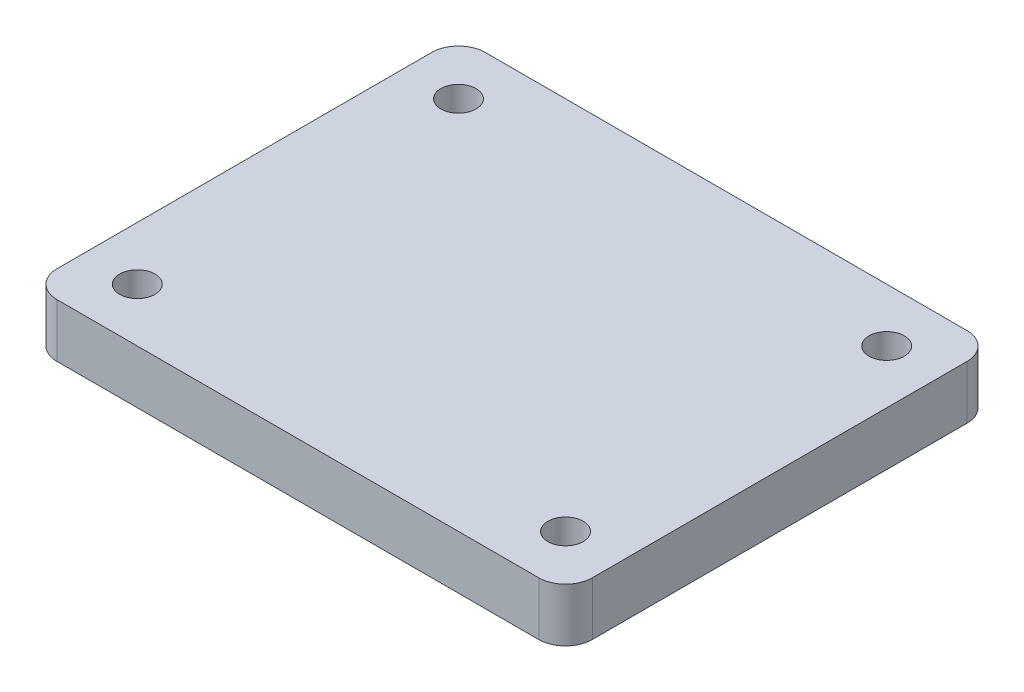
ISO-10303-21;
HEADER;
FILE_DESCRIPTION(('STEP AP214'),'2;1');
FILE_NAME('part.step','',(''),(''),'','','');
FILE_SCHEMA(('AUTOMOTIVE_DESIGN { 1 0 10303 214 1 1 1 1 }'));
ENDSEC;
DATA;
#1=APPLICATION_CONTEXT('core data for automotive mechanical design processes');
#2=APPLICATION_PROTOCOL_DEFINITION('international standard','automotive_design',2000,#1);
#3=PRODUCT_CONTEXT('',#1,'mechanical');
#4=PRODUCT('Part','Part','',(#3));
#5=PRODUCT_RELATED_PRODUCT_CATEGORY('part','',(#4));
#6=PRODUCT_DEFINITION_FORMATION('','',#4);
#7=PRODUCT_DEFINITION_CONTEXT('part definition',#1,'design');
#8=PRODUCT_DEFINITION('design','',#6,#7);
#9=PRODUCT_DEFINITION_SHAPE('','',#8);
#10=(LENGTH_UNIT() NAMED_UNIT(*) SI_UNIT(.MILLI.,.METRE.));
#11=(NAMED_UNIT(*) PLANE_ANGLE_UNIT() SI_UNIT($,.RADIAN.));
#12=(NAMED_UNIT(*) SI_UNIT($,.STERADIAN.) SOLID_ANGLE_UNIT());
#13=UNCERTAINTY_MEASURE_WITH_UNIT(LENGTH_MEASURE(1.E-05),#10,'distance_accuracy_value','');
#14=(GEOMETRIC_REPRESENTATION_CONTEXT(3) GLOBAL_UNCERTAINTY_ASSIGNED_CONTEXT((#13)) GLOBAL_UNIT_ASSIGNED_CONTEXT((#10,
#11,#12)) REPRESENTATION_CONTEXT('',''));
#15=CARTESIAN_POINT('',(0.,0.,0.));
#16=DIRECTION('',(0.,0.,1.));
#17=DIRECTION('',(1.,0.,0.));
#18=AXIS2_PLACEMENT_3D('',#15,#16,#17);
#19=CARTESIAN_POINT('',(0.,10.,0.));
#20=DIRECTION('',(1.,0.,0.));
#21=DIRECTION('',(0.,0.,-1.));
#22=AXIS2_PLACEMENT_3D('',#19,#20,#21);
#23=PLANE('',#22);
#24=DIRECTION('',(0.,0.,1.));
#25=VECTOR('',#24,1.);
#26=CARTESIAN_POINT('',(0.,10.,0.));
#27=LINE('',#26,#25);
#28=CARTESIAN_POINT('',(0.,10.,-75.));
#29=VERTEX_POINT('',#28);
#30=CARTESIAN_POINT('',(0.,10.,-5.));
#31=VERTEX_POINT('',#30);
#32=EDGE_CURVE('E122',#29,#31,#27,.T.);
#33=ORIENTED_EDGE('',*,*,#32,.F.);
#34=DIRECTION('',(0.,-1.,0.));
#35=VECTOR('',#34,1.);
#36=CARTESIAN_POINT('',(0.,10.,-75.));
#37=LINE('',#36,#35);
#38=CARTESIAN_POINT('',(0.,0.,-75.));
#39=VERTEX_POINT('',#38);
#40=EDGE_CURVE('E107',#29,#39,#37,.T.);
#41=ORIENTED_EDGE('',*,*,#40,.T.);
#42=DIRECTION('',(0.,0.,1.));
#43=VECTOR('',#42,1.);
#44=CARTESIAN_POINT('',(0.,0.,0.));
#45=LINE('',#44,#43);
#46=CARTESIAN_POINT('',(0.,0.,-5.));
#47=VERTEX_POINT('',#46);
#48=EDGE_CURVE('E119',#39,#47,#45,.T.);
#49=ORIENTED_EDGE('',*,*,#48,.T.);
#50=DIRECTION('',(0.,-1.,0.));
#51=VECTOR('',#50,1.);
#52=CARTESIAN_POINT('',(0.,10.,-5.));
#53=LINE('',#52,#51);
#54=EDGE_CURVE('E124',#47,#31,#53,.F.);
#55=ORIENTED_EDGE('',*,*,#54,.T.);
#56=EDGE_LOOP('',(#33,#41,#49,#55));
#57=FACE_BOUND('',#56,.T.);
#58=ADVANCED_FACE('F37',(#57),#23,.F.);
#59=CARTESIAN_POINT('',(0.,10.,0.));
#60=DIRECTION('',(0.,0.,-1.));
#61=DIRECTION('',(-1.,0.,0.));
#62=AXIS2_PLACEMENT_3D('',#59,#60,#61);
#63=PLANE('',#62);
#64=DIRECTION('',(1.,0.,0.));
#65=VECTOR('',#64,1.);
#66=CARTESIAN_POINT('',(0.,0.,0.));
#67=LINE('',#66,#65);
#68=CARTESIAN_POINT('',(5.,0.,0.));
#69=VERTEX_POINT('',#68);
#70=CARTESIAN_POINT('',(95.,0.,0.));
#71=VERTEX_POINT('',#70);
#72=EDGE_CURVE('E128',#69,#71,#67,.T.);
#73=ORIENTED_EDGE('',*,*,#72,.T.);
#74=DIRECTION('',(0.,-1.,0.));
#75=VECTOR('',#74,1.);
#76=CARTESIAN_POINT('',(95.,10.,0.));
#77=LINE('',#76,#75);
#78=CARTESIAN_POINT('',(95.,10.,0.));
#79=VERTEX_POINT('',#78);
#80=EDGE_CURVE('E11',#71,#79,#77,.F.);
#81=ORIENTED_EDGE('',*,*,#80,.T.);
#82=DIRECTION('',(1.,0.,0.));
#83=VECTOR('',#82,1.);
#84=CARTESIAN_POINT('',(0.,10.,0.));
#85=LINE('',#84,#83);
#86=CARTESIAN_POINT('',(5.,10.,0.));
#87=VERTEX_POINT('',#86);
#88=EDGE_CURVE('E168',#87,#79,#85,.T.);
#89=ORIENTED_EDGE('',*,*,#88,.F.);
#90=DIRECTION('',(0.,-1.,0.));
#91=VECTOR('',#90,1.);
#92=CARTESIAN_POINT('',(5.,10.,0.));
#93=LINE('',#92,#91);
#94=EDGE_CURVE('E45',#87,#69,#93,.T.);
#95=ORIENTED_EDGE('',*,*,#94,.T.);
#96=EDGE_LOOP('',(#73,#81,#89,#95));
#97=FACE_BOUND('',#96,.T.);
#98=ADVANCED_FACE('F166',(#97),#63,.F.);
#99=CARTESIAN_POINT('',(100.,10.,0.));
#100=DIRECTION('',(-1.,0.,0.));
#101=DIRECTION('',(0.,0.,1.));
#102=AXIS2_PLACEMENT_3D('',#99,#100,#101);
#103=PLANE('',#102);
#104=DIRECTION('',(0.,0.,-1.));
#105=VECTOR('',#104,1.);
#106=CARTESIAN_POINT('',(100.,0.,0.));
#107=LINE('',#106,#105);
#108=CARTESIAN_POINT('',(100.,0.,-5.));
#109=VERTEX_POINT('',#108);
#110=CARTESIAN_POINT('',(100.,0.,-75.));
#111=VERTEX_POINT('',#110);
#112=EDGE_CURVE('E132',#109,#111,#107,.T.);
#113=ORIENTED_EDGE('',*,*,#112,.T.);
#114=DIRECTION('',(0.,-1.,0.));
#115=VECTOR('',#114,1.);
#116=CARTESIAN_POINT('',(100.,10.,-75.));
#117=LINE('',#116,#115);
#118=CARTESIAN_POINT('',(100.,10.,-75.));
#119=VERTEX_POINT('',#118);
#120=EDGE_CURVE('E52',#111,#119,#117,.F.);
#121=ORIENTED_EDGE('',*,*,#120,.T.);
#122=DIRECTION('',(0.,0.,-1.));
#123=VECTOR('',#122,1.);
#124=CARTESIAN_POINT('',(100.,10.,0.));
#125=LINE('',#124,#123);
#126=CARTESIAN_POINT('',(100.,10.,-5.));
#127=VERTEX_POINT('',#126);
#128=EDGE_CURVE('E176',#127,#119,#125,.T.);
#129=ORIENTED_EDGE('',*,*,#128,.F.);
#130=DIRECTION('',(0.,-1.,0.));
#131=VECTOR('',#130,1.);
#132=CARTESIAN_POINT('',(100.,10.,-5.));
#133=LINE('',#132,#131);
#134=EDGE_CURVE('E159',#127,#109,#133,.T.);
#135=ORIENTED_EDGE('',*,*,#134,.T.);
#136=EDGE_LOOP('',(#113,#121,#129,#135));
#137=FACE_BOUND('',#136,.T.);
#138=ADVANCED_FACE('F175',(#137),#103,.F.);
#139=CARTESIAN_POINT('',(0.,10.,-80.));
#140=DIRECTION('',(0.,0.,1.));
#141=DIRECTION('',(1.,0.,0.));
#142=AXIS2_PLACEMENT_3D('',#139,#140,#141);
#143=PLANE('',#142);
#144=DIRECTION('',(-1.,0.,0.));
#145=VECTOR('',#144,1.);
#146=CARTESIAN_POINT('',(0.,0.,-80.));
#147=LINE('',#146,#145);
#148=CARTESIAN_POINT('',(95.,0.,-80.));
#149=VERTEX_POINT('',#148);
#150=CARTESIAN_POINT('',(5.,0.,-80.));
#151=VERTEX_POINT('',#150);
#152=EDGE_CURVE('E142',#149,#151,#147,.T.);
#153=ORIENTED_EDGE('',*,*,#152,.T.);
#154=DIRECTION('',(0.,-1.,0.));
#155=VECTOR('',#154,1.);
#156=CARTESIAN_POINT('',(5.,10.,-80.));
#157=LINE('',#156,#155);
#158=CARTESIAN_POINT('',(5.,10.,-80.));
#159=VERTEX_POINT('',#158);
#160=EDGE_CURVE('E108',#151,#159,#157,.F.);
#161=ORIENTED_EDGE('',*,*,#160,.T.);
#162=DIRECTION('',(-1.,0.,0.));
#163=VECTOR('',#162,1.);
#164=CARTESIAN_POINT('',(0.,10.,-80.));
#165=LINE('',#164,#163);
#166=CARTESIAN_POINT('',(95.,10.,-80.));
#167=VERTEX_POINT('',#166);
#168=EDGE_CURVE('E138',#167,#159,#165,.T.);
#169=ORIENTED_EDGE('',*,*,#168,.F.);
#170=DIRECTION('',(0.,-1.,0.));
#171=VECTOR('',#170,1.);
#172=CARTESIAN_POINT('',(95.,10.,-80.));
#173=LINE('',#172,#171);
#174=EDGE_CURVE('E113',#167,#149,#173,.T.);
#175=ORIENTED_EDGE('',*,*,#174,.T.);
#176=EDGE_LOOP('',(#153,#161,#169,#175));
#177=FACE_BOUND('',#176,.T.);
#178=ADVANCED_FACE('F209',(#177),#143,.F.);
#179=CARTESIAN_POINT('',(0.,10.,0.));
#180=DIRECTION('',(0.,-1.,0.));
#181=DIRECTION('',(0.,0.,-1.));
#182=AXIS2_PLACEMENT_3D('',#179,#180,#181);
#183=PLANE('',#182);
#184=CARTESIAN_POINT('',(90.,10.,-10.));
#185=DIRECTION('',(0.,1.,0.));
#186=DIRECTION('',(0.,0.,1.));
#187=AXIS2_PLACEMENT_3D('',#184,#185,#186);
#188=CIRCLE('',#187,3.3);
#189=CARTESIAN_POINT('',(90.,10.,-6.7));
#190=VERTEX_POINT('',#189);
#191=EDGE_CURVE('E183',#190,#190,#188,.T.);
#192=ORIENTED_EDGE('',*,*,#191,.F.);
#193=EDGE_LOOP('',(#192));
#194=FACE_BOUND('',#193,.T.);
#195=CARTESIAN_POINT('',(10.,10.,-70.));
#196=DIRECTION('',(0.,1.,0.));
#197=DIRECTION('',(0.,0.,1.));
#198=AXIS2_PLACEMENT_3D('',#195,#196,#197);
#199=CIRCLE('',#198,3.3);
#200=CARTESIAN_POINT('',(10.,10.,-66.7));
#201=VERTEX_POINT('',#200);
#202=EDGE_CURVE('E188',#201,#201,#199,.T.);
#203=ORIENTED_EDGE('',*,*,#202,.F.);
#204=EDGE_LOOP('',(#203));
#205=FACE_BOUND('',#204,.T.);
#206=CARTESIAN_POINT('',(90.,10.,-70.));
#207=DIRECTION('',(0.,1.,0.));
#208=DIRECTION('',(0.,0.,1.));
#209=AXIS2_PLACEMENT_3D('',#206,#207,#208);
#210=CIRCLE('',#209,3.3);
#211=CARTESIAN_POINT('',(90.,10.,-66.7));
#212=VERTEX_POINT('',#211);
#213=EDGE_CURVE('E189',#212,#212,#210,.T.);
#214=ORIENTED_EDGE('',*,*,#213,.F.);
#215=EDGE_LOOP('',(#214));
#216=FACE_BOUND('',#215,.T.);
#217=CARTESIAN_POINT('',(10.,10.,-10.));
#218=DIRECTION('',(0.,1.,0.));
#219=DIRECTION('',(0.,0.,1.));
#220=AXIS2_PLACEMENT_3D('',#217,#218,#219);
#221=CIRCLE('',#220,3.3);
#222=CARTESIAN_POINT('',(10.,10.,-6.7));
#223=VERTEX_POINT('',#222);
#224=EDGE_CURVE('E129',#223,#223,#221,.T.);
#225=ORIENTED_EDGE('',*,*,#224,.F.);
#226=EDGE_LOOP('',(#225));
#227=FACE_BOUND('',#226,.T.);
#228=ORIENTED_EDGE('',*,*,#168,.T.);
#229=CARTESIAN_POINT('',(5.,10.,-75.));
#230=DIRECTION('',(0.,-1.,0.));
#231=DIRECTION('',(0.,0.,-1.));
#232=AXIS2_PLACEMENT_3D('',#229,#230,#231);
#233=CIRCLE('',#232,5.);
#234=EDGE_CURVE('E157',#159,#29,#233,.F.);
#235=ORIENTED_EDGE('',*,*,#234,.T.);
#236=ORIENTED_EDGE('',*,*,#32,.T.);
#237=CARTESIAN_POINT('',(5.,10.,-5.));
#238=DIRECTION('',(0.,-1.,0.));
#239=DIRECTION('',(0.,0.,-1.));
#240=AXIS2_PLACEMENT_3D('',#237,#238,#239);
#241=CIRCLE('',#240,5.);
#242=EDGE_CURVE('E152',#31,#87,#241,.F.);
#243=ORIENTED_EDGE('',*,*,#242,.T.);
#244=ORIENTED_EDGE('',*,*,#88,.T.);
#245=CARTESIAN_POINT('',(95.,10.,-5.));
#246=DIRECTION('',(0.,-1.,0.));
#247=DIRECTION('',(0.,0.,-1.));
#248=AXIS2_PLACEMENT_3D('',#245,#246,#247);
#249=CIRCLE('',#248,5.);
#250=EDGE_CURVE('E59',#79,#127,#249,.F.);
#251=ORIENTED_EDGE('',*,*,#250,.T.);
#252=ORIENTED_EDGE('',*,*,#128,.T.);
#253=CARTESIAN_POINT('',(95.,10.,-75.));
#254=DIRECTION('',(0.,-1.,0.));
#255=DIRECTION('',(0.,0.,-1.));
#256=AXIS2_PLACEMENT_3D('',#253,#254,#255);
#257=CIRCLE('',#256,5.);
#258=EDGE_CURVE('E155',#119,#167,#257,.F.);
#259=ORIENTED_EDGE('',*,*,#258,.T.);
#260=EDGE_LOOP('',(#228,#235,#236,#243,#244,#251,#252,#259));
#261=FACE_BOUND('',#260,.T.);
#262=ADVANCED_FACE('F206',(#194,#205,#216,#227,#261),#183,.F.);
#263=CARTESIAN_POINT('',(0.,0.,0.));
#264=DIRECTION('',(0.,-1.,0.));
#265=DIRECTION('',(0.,0.,-1.));
#266=AXIS2_PLACEMENT_3D('',#263,#264,#265);
#267=PLANE('',#266);
#268=CARTESIAN_POINT('',(90.,0.,-10.));
#269=DIRECTION('',(0.,1.,0.));
#270=DIRECTION('',(0.,0.,1.));
#271=AXIS2_PLACEMENT_3D('',#268,#269,#270);
#272=CIRCLE('',#271,3.3);
#273=CARTESIAN_POINT('',(90.,0.,-6.7));
#274=VERTEX_POINT('',#273);
#275=EDGE_CURVE('E192',#274,#274,#272,.T.);
#276=ORIENTED_EDGE('',*,*,#275,.T.);
#277=EDGE_LOOP('',(#276));
#278=FACE_BOUND('',#277,.T.);
#279=CARTESIAN_POINT('',(10.,0.,-70.));
#280=DIRECTION('',(0.,1.,0.));
#281=DIRECTION('',(0.,0.,1.));
#282=AXIS2_PLACEMENT_3D('',#279,#280,#281);
#283=CIRCLE('',#282,3.3);
#284=CARTESIAN_POINT('',(10.,0.,-66.7));
#285=VERTEX_POINT('',#284);
#286=EDGE_CURVE('E185',#285,#285,#283,.T.);
#287=ORIENTED_EDGE('',*,*,#286,.T.);
#288=EDGE_LOOP('',(#287));
#289=FACE_BOUND('',#288,.T.);
#290=CARTESIAN_POINT('',(90.,0.,-70.));
#291=DIRECTION('',(0.,1.,0.));
#292=DIRECTION('',(0.,0.,1.));
#293=AXIS2_PLACEMENT_3D('',#290,#291,#292);
#294=CIRCLE('',#293,3.3);
#295=CARTESIAN_POINT('',(90.,0.,-66.7));
#296=VERTEX_POINT('',#295);
#297=EDGE_CURVE('E197',#296,#296,#294,.T.);
#298=ORIENTED_EDGE('',*,*,#297,.T.);
#299=EDGE_LOOP('',(#298));
#300=FACE_BOUND('',#299,.T.);
#301=CARTESIAN_POINT('',(10.,0.,-10.));
#302=DIRECTION('',(0.,1.,0.));
#303=DIRECTION('',(0.,0.,1.));
#304=AXIS2_PLACEMENT_3D('',#301,#302,#303);
#305=CIRCLE('',#304,3.3);
#306=CARTESIAN_POINT('',(10.,0.,-6.7));
#307=VERTEX_POINT('',#306);
#308=EDGE_CURVE('E135',#307,#307,#305,.T.);
#309=ORIENTED_EDGE('',*,*,#308,.T.);
#310=EDGE_LOOP('',(#309));
#311=FACE_BOUND('',#310,.T.);
#312=ORIENTED_EDGE('',*,*,#48,.F.);
#313=CARTESIAN_POINT('',(5.,0.,-75.));
#314=DIRECTION('',(0.,-1.,0.));
#315=DIRECTION('',(0.,0.,-1.));
#316=AXIS2_PLACEMENT_3D('',#313,#314,#315);
#317=CIRCLE('',#316,5.);
#318=EDGE_CURVE('E103',#39,#151,#317,.T.);
#319=ORIENTED_EDGE('',*,*,#318,.T.);
#320=ORIENTED_EDGE('',*,*,#152,.F.);
#321=CARTESIAN_POINT('',(95.,0.,-75.));
#322=DIRECTION('',(0.,-1.,0.));
#323=DIRECTION('',(0.,0.,-1.));
#324=AXIS2_PLACEMENT_3D('',#321,#322,#323);
#325=CIRCLE('',#324,5.);
#326=EDGE_CURVE('E114',#149,#111,#325,.T.);
#327=ORIENTED_EDGE('',*,*,#326,.T.);
#328=ORIENTED_EDGE('',*,*,#112,.F.);
#329=CARTESIAN_POINT('',(95.,0.,-5.));
#330=DIRECTION('',(0.,-1.,0.));
#331=DIRECTION('',(0.,0.,-1.));
#332=AXIS2_PLACEMENT_3D('',#329,#330,#331);
#333=CIRCLE('',#332,5.);
#334=EDGE_CURVE('E146',#109,#71,#333,.T.);
#335=ORIENTED_EDGE('',*,*,#334,.T.);
#336=ORIENTED_EDGE('',*,*,#72,.F.);
#337=CARTESIAN_POINT('',(5.,0.,-5.));
#338=DIRECTION('',(0.,-1.,0.));
#339=DIRECTION('',(0.,0.,-1.));
#340=AXIS2_PLACEMENT_3D('',#337,#338,#339);
#341=CIRCLE('',#340,5.);
#342=EDGE_CURVE('E123',#69,#47,#341,.T.);
#343=ORIENTED_EDGE('',*,*,#342,.T.);
#344=EDGE_LOOP('',(#312,#319,#320,#327,#328,#335,#336,#343));
#345=FACE_BOUND('',#344,.T.);
#346=ADVANCED_FACE('F126',(#278,#289,#300,#311,#345),#267,.T.);
#347=CARTESIAN_POINT('',(10.,10.,-10.));
#348=DIRECTION('',(0.,-1.,0.));
#349=DIRECTION('',(0.,0.,-1.));
#350=AXIS2_PLACEMENT_3D('',#347,#348,#349);
#351=CYLINDRICAL_SURFACE('',#350,3.3);
#352=ORIENTED_EDGE('',*,*,#224,.T.);
#353=EDGE_LOOP('',(#352));
#354=FACE_BOUND('',#353,.T.);
#355=ORIENTED_EDGE('',*,*,#308,.F.);
#356=EDGE_LOOP('',(#355));
#357=FACE_BOUND('',#356,.T.);
#358=ADVANCED_FACE('F238',(#354,#357),#351,.F.);
#359=CARTESIAN_POINT('',(90.,10.,-70.));
#360=DIRECTION('',(0.,-1.,0.));
#361=DIRECTION('',(0.,0.,-1.));
#362=AXIS2_PLACEMENT_3D('',#359,#360,#361);
#363=CYLINDRICAL_SURFACE('',#362,3.3);
#364=ORIENTED_EDGE('',*,*,#213,.T.);
#365=EDGE_LOOP('',(#364));
#366=FACE_BOUND('',#365,.T.);
#367=ORIENTED_EDGE('',*,*,#297,.F.);
#368=EDGE_LOOP('',(#367));
#369=FACE_BOUND('',#368,.T.);
#370=ADVANCED_FACE('F203',(#366,#369),#363,.F.);
#371=CARTESIAN_POINT('',(10.,10.,-70.));
#372=DIRECTION('',(0.,-1.,0.));
#373=DIRECTION('',(0.,0.,-1.));
#374=AXIS2_PLACEMENT_3D('',#371,#372,#373);
#375=CYLINDRICAL_SURFACE('',#374,3.3);
#376=ORIENTED_EDGE('',*,*,#202,.T.);
#377=EDGE_LOOP('',(#376));
#378=FACE_BOUND('',#377,.T.);
#379=ORIENTED_EDGE('',*,*,#286,.F.);
#380=EDGE_LOOP('',(#379));
#381=FACE_BOUND('',#380,.T.);
#382=ADVANCED_FACE('F244',(#378,#381),#375,.F.);
#383=CARTESIAN_POINT('',(90.,10.,-10.));
#384=DIRECTION('',(0.,-1.,0.));
#385=DIRECTION('',(0.,0.,-1.));
#386=AXIS2_PLACEMENT_3D('',#383,#384,#385);
#387=CYLINDRICAL_SURFACE('',#386,3.3);
#388=ORIENTED_EDGE('',*,*,#191,.T.);
#389=EDGE_LOOP('',(#388));
#390=FACE_BOUND('',#389,.T.);
#391=ORIENTED_EDGE('',*,*,#275,.F.);
#392=EDGE_LOOP('',(#391));
#393=FACE_BOUND('',#392,.T.);
#394=ADVANCED_FACE('F224',(#390,#393),#387,.F.);
#395=CARTESIAN_POINT('',(5.,10.,-75.));
#396=DIRECTION('',(0.,-1.,0.));
#397=DIRECTION('',(0.,0.,-1.));
#398=AXIS2_PLACEMENT_3D('',#395,#396,#397);
#399=CYLINDRICAL_SURFACE('',#398,5.);
#400=ORIENTED_EDGE('',*,*,#234,.F.);
#401=ORIENTED_EDGE('',*,*,#160,.F.);
#402=ORIENTED_EDGE('',*,*,#318,.F.);
#403=ORIENTED_EDGE('',*,*,#40,.F.);
#404=EDGE_LOOP('',(#400,#401,#402,#403));
#405=FACE_BOUND('',#404,.T.);
#406=ADVANCED_FACE('F106',(#405),#399,.T.);
#407=CARTESIAN_POINT('',(95.,10.,-75.));
#408=DIRECTION('',(0.,-1.,0.));
#409=DIRECTION('',(0.,0.,-1.));
#410=AXIS2_PLACEMENT_3D('',#407,#408,#409);
#411=CYLINDRICAL_SURFACE('',#410,5.);
#412=ORIENTED_EDGE('',*,*,#258,.F.);
#413=ORIENTED_EDGE('',*,*,#120,.F.);
#414=ORIENTED_EDGE('',*,*,#326,.F.);
#415=ORIENTED_EDGE('',*,*,#174,.F.);
#416=EDGE_LOOP('',(#412,#413,#414,#415));
#417=FACE_BOUND('',#416,.T.);
#418=ADVANCED_FACE('F217',(#417),#411,.T.);
#419=CARTESIAN_POINT('',(95.,10.,-5.));
#420=DIRECTION('',(0.,-1.,0.));
#421=DIRECTION('',(0.,0.,-1.));
#422=AXIS2_PLACEMENT_3D('',#419,#420,#421);
#423=CYLINDRICAL_SURFACE('',#422,5.);
#424=ORIENTED_EDGE('',*,*,#250,.F.);
#425=ORIENTED_EDGE('',*,*,#80,.F.);
#426=ORIENTED_EDGE('',*,*,#334,.F.);
#427=ORIENTED_EDGE('',*,*,#134,.F.);
#428=EDGE_LOOP('',(#424,#425,#426,#427));
#429=FACE_BOUND('',#428,.T.);
#430=ADVANCED_FACE('F174',(#429),#423,.T.);
#431=CARTESIAN_POINT('',(5.,10.,-5.));
#432=DIRECTION('',(0.,-1.,0.));
#433=DIRECTION('',(0.,0.,-1.));
#434=AXIS2_PLACEMENT_3D('',#431,#432,#433);
#435=CYLINDRICAL_SURFACE('',#434,5.);
#436=ORIENTED_EDGE('',*,*,#242,.F.);
#437=ORIENTED_EDGE('',*,*,#54,.F.);
#438=ORIENTED_EDGE('',*,*,#342,.F.);
#439=ORIENTED_EDGE('',*,*,#94,.F.);
#440=EDGE_LOOP('',(#436,#437,#438,#439));
#441=FACE_BOUND('',#440,.T.);
#442=ADVANCED_FACE('F39',(#441),#435,.T.);
#443=CLOSED_SHELL('',(#58,#98,#138,#178,#262,#346,#358,#370,#382,#394,#406,#418,#430,#442));
#444=MANIFOLD_SOLID_BREP('B2',#443);
#445=ADVANCED_BREP_SHAPE_REPRESENTATION('',(#18,#444),#14);
#446=SHAPE_DEFINITION_REPRESENTATION(#9,#445);
ENDSEC;
END-ISO-10303-21;
